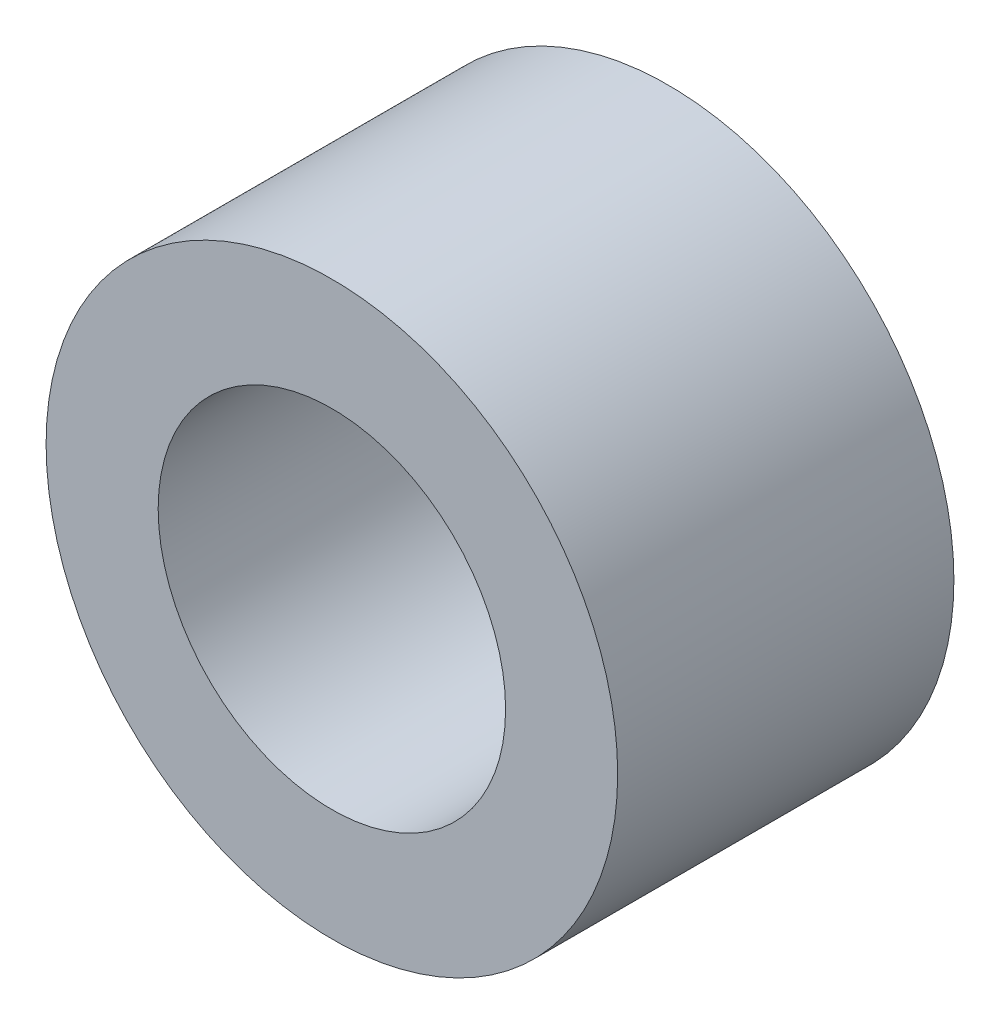
ISO-10303-21;
HEADER;
FILE_DESCRIPTION(('STEP AP214'),'2;1');
FILE_NAME('part.step','',(''),(''),'','','');
FILE_SCHEMA(('AUTOMOTIVE_DESIGN { 1 0 10303 214 1 1 1 1 }'));
ENDSEC;
DATA;
#1=APPLICATION_CONTEXT('core data for automotive mechanical design processes');
#2=APPLICATION_PROTOCOL_DEFINITION('international standard','automotive_design',2000,#1);
#3=PRODUCT_CONTEXT('',#1,'mechanical');
#4=PRODUCT('Part','Part','',(#3));
#5=PRODUCT_RELATED_PRODUCT_CATEGORY('part','',(#4));
#6=PRODUCT_DEFINITION_FORMATION('','',#4);
#7=PRODUCT_DEFINITION_CONTEXT('part definition',#1,'design');
#8=PRODUCT_DEFINITION('design','',#6,#7);
#9=PRODUCT_DEFINITION_SHAPE('','',#8);
#10=(LENGTH_UNIT() NAMED_UNIT(*) SI_UNIT(.MILLI.,.METRE.));
#11=(NAMED_UNIT(*) PLANE_ANGLE_UNIT() SI_UNIT($,.RADIAN.));
#12=(NAMED_UNIT(*) SI_UNIT($,.STERADIAN.) SOLID_ANGLE_UNIT());
#13=UNCERTAINTY_MEASURE_WITH_UNIT(LENGTH_MEASURE(1.E-05),#10,'distance_accuracy_value','');
#14=(GEOMETRIC_REPRESENTATION_CONTEXT(3) GLOBAL_UNCERTAINTY_ASSIGNED_CONTEXT((#13)) GLOBAL_UNIT_ASSIGNED_CONTEXT((#10,
#11,#12)) REPRESENTATION_CONTEXT('',''));
#15=CARTESIAN_POINT('',(0.,0.,0.));
#16=DIRECTION('',(0.,0.,1.));
#17=DIRECTION('',(1.,0.,0.));
#18=AXIS2_PLACEMENT_3D('',#15,#16,#17);
#19=CARTESIAN_POINT('',(0.,0.,1.5));
#20=DIRECTION('',(0.,0.,1.));
#21=DIRECTION('',(1.,0.,0.));
#22=AXIS2_PLACEMENT_3D('',#19,#20,#21);
#23=PLANE('',#22);
#24=CARTESIAN_POINT('',(0.,0.,1.5));
#25=DIRECTION('',(0.,0.,1.));
#26=DIRECTION('',(1.,0.,0.));
#27=AXIS2_PLACEMENT_3D('',#24,#25,#26);
#28=CIRCLE('',#27,2.55);
#29=CARTESIAN_POINT('',(2.55,0.,1.5));
#30=VERTEX_POINT('',#29);
#31=EDGE_CURVE('E10',#30,#30,#28,.T.);
#32=ORIENTED_EDGE('',*,*,#31,.T.);
#33=EDGE_LOOP('',(#32));
#34=FACE_BOUND('',#33,.T.);
#35=CARTESIAN_POINT('',(0.,0.,1.5));
#36=DIRECTION('',(0.,0.,1.));
#37=DIRECTION('',(1.,0.,0.));
#38=AXIS2_PLACEMENT_3D('',#35,#36,#37);
#39=CIRCLE('',#38,1.55);
#40=CARTESIAN_POINT('',(1.55,0.,1.5));
#41=VERTEX_POINT('',#40);
#42=EDGE_CURVE('E43',#41,#41,#39,.T.);
#43=ORIENTED_EDGE('',*,*,#42,.F.);
#44=EDGE_LOOP('',(#43));
#45=FACE_BOUND('',#44,.T.);
#46=ADVANCED_FACE('F32',(#34,#45),#23,.T.);
#47=CARTESIAN_POINT('',(0.,0.,-1.5));
#48=DIRECTION('',(0.,0.,1.));
#49=DIRECTION('',(1.,0.,0.));
#50=AXIS2_PLACEMENT_3D('',#47,#48,#49);
#51=PLANE('',#50);
#52=CARTESIAN_POINT('',(0.,0.,-1.5));
#53=DIRECTION('',(0.,0.,1.));
#54=DIRECTION('',(1.,0.,0.));
#55=AXIS2_PLACEMENT_3D('',#52,#53,#54);
#56=CIRCLE('',#55,2.55);
#57=CARTESIAN_POINT('',(2.55,0.,-1.5));
#58=VERTEX_POINT('',#57);
#59=EDGE_CURVE('E36',#58,#58,#56,.T.);
#60=ORIENTED_EDGE('',*,*,#59,.F.);
#61=EDGE_LOOP('',(#60));
#62=FACE_BOUND('',#61,.T.);
#63=CARTESIAN_POINT('',(0.,0.,-1.5));
#64=DIRECTION('',(0.,0.,1.));
#65=DIRECTION('',(1.,0.,0.));
#66=AXIS2_PLACEMENT_3D('',#63,#64,#65);
#67=CIRCLE('',#66,1.55);
#68=CARTESIAN_POINT('',(1.55,0.,-1.5));
#69=VERTEX_POINT('',#68);
#70=EDGE_CURVE('E45',#69,#69,#67,.T.);
#71=ORIENTED_EDGE('',*,*,#70,.T.);
#72=EDGE_LOOP('',(#71));
#73=FACE_BOUND('',#72,.T.);
#74=ADVANCED_FACE('F55',(#62,#73),#51,.F.);
#75=CARTESIAN_POINT('',(0.,0.,1.5));
#76=DIRECTION('',(0.,0.,-1.));
#77=DIRECTION('',(-1.,0.,0.));
#78=AXIS2_PLACEMENT_3D('',#75,#76,#77);
#79=CYLINDRICAL_SURFACE('',#78,2.55);
#80=ORIENTED_EDGE('',*,*,#31,.F.);
#81=EDGE_LOOP('',(#80));
#82=FACE_BOUND('',#81,.T.);
#83=ORIENTED_EDGE('',*,*,#59,.T.);
#84=EDGE_LOOP('',(#83));
#85=FACE_BOUND('',#84,.T.);
#86=ADVANCED_FACE('F34',(#82,#85),#79,.T.);
#87=CARTESIAN_POINT('',(0.,0.,1.5));
#88=DIRECTION('',(0.,0.,-1.));
#89=DIRECTION('',(-1.,0.,0.));
#90=AXIS2_PLACEMENT_3D('',#87,#88,#89);
#91=CYLINDRICAL_SURFACE('',#90,1.55);
#92=ORIENTED_EDGE('',*,*,#42,.T.);
#93=EDGE_LOOP('',(#92));
#94=FACE_BOUND('',#93,.T.);
#95=ORIENTED_EDGE('',*,*,#70,.F.);
#96=EDGE_LOOP('',(#95));
#97=FACE_BOUND('',#96,.T.);
#98=ADVANCED_FACE('F51',(#94,#97),#91,.F.);
#99=CLOSED_SHELL('',(#46,#74,#86,#98));
#100=MANIFOLD_SOLID_BREP('B2',#99);
#101=ADVANCED_BREP_SHAPE_REPRESENTATION('',(#18,#100),#14);
#102=SHAPE_DEFINITION_REPRESENTATION(#9,#101);
ENDSEC;
END-ISO-10303-21;
